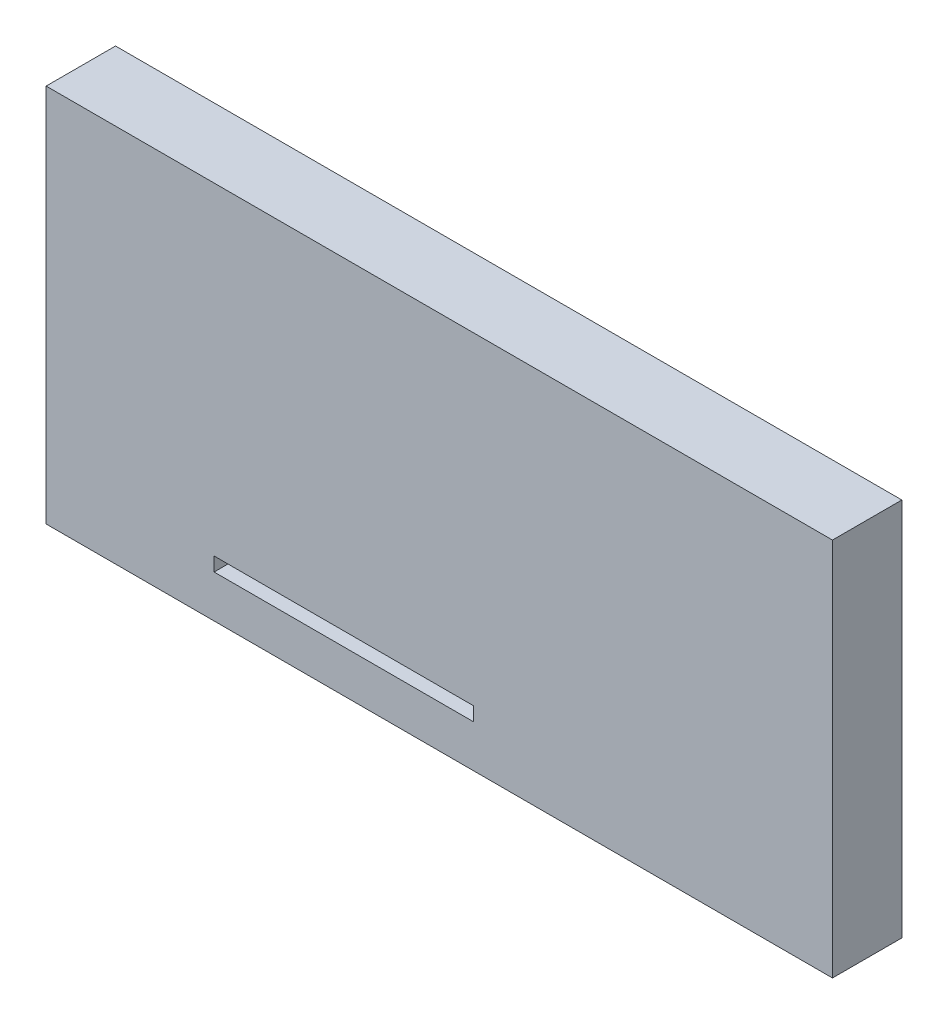
ISO-10303-21;
HEADER;
FILE_DESCRIPTION(('STEP AP214'),'2;1');
FILE_NAME('part.step','',(''),(''),'','','');
FILE_SCHEMA(('AUTOMOTIVE_DESIGN { 1 0 10303 214 1 1 1 1 }'));
ENDSEC;
DATA;
#1=APPLICATION_CONTEXT('core data for automotive mechanical design processes');
#2=APPLICATION_PROTOCOL_DEFINITION('international standard','automotive_design',2000,#1);
#3=PRODUCT_CONTEXT('',#1,'mechanical');
#4=PRODUCT('Part','Part','',(#3));
#5=PRODUCT_RELATED_PRODUCT_CATEGORY('part','',(#4));
#6=PRODUCT_DEFINITION_FORMATION('','',#4);
#7=PRODUCT_DEFINITION_CONTEXT('part definition',#1,'design');
#8=PRODUCT_DEFINITION('design','',#6,#7);
#9=PRODUCT_DEFINITION_SHAPE('','',#8);
#10=(LENGTH_UNIT() NAMED_UNIT(*) SI_UNIT(.MILLI.,.METRE.));
#11=(NAMED_UNIT(*) PLANE_ANGLE_UNIT() SI_UNIT($,.RADIAN.));
#12=(NAMED_UNIT(*) SI_UNIT($,.STERADIAN.) SOLID_ANGLE_UNIT());
#13=UNCERTAINTY_MEASURE_WITH_UNIT(LENGTH_MEASURE(1.E-05),#10,'distance_accuracy_value','');
#14=(GEOMETRIC_REPRESENTATION_CONTEXT(3) GLOBAL_UNCERTAINTY_ASSIGNED_CONTEXT((#13)) GLOBAL_UNIT_ASSIGNED_CONTEXT((#10,
#11,#12)) REPRESENTATION_CONTEXT('',''));
#15=CARTESIAN_POINT('',(0.,0.,0.));
#16=DIRECTION('',(0.,0.,1.));
#17=DIRECTION('',(1.,0.,0.));
#18=AXIS2_PLACEMENT_3D('',#15,#16,#17);
#19=CARTESIAN_POINT('',(85.,-41.,15.));
#20=DIRECTION('',(-1.,0.,0.));
#21=DIRECTION('',(0.,0.,1.));
#22=AXIS2_PLACEMENT_3D('',#19,#20,#21);
#23=PLANE('',#22);
#24=DIRECTION('',(0.,1.,0.));
#25=VECTOR('',#24,1.);
#26=CARTESIAN_POINT('',(85.,-41.,0.));
#27=LINE('',#26,#25);
#28=CARTESIAN_POINT('',(85.,-41.,0.));
#29=VERTEX_POINT('',#28);
#30=CARTESIAN_POINT('',(85.,41.,0.));
#31=VERTEX_POINT('',#30);
#32=EDGE_CURVE('E157',#29,#31,#27,.T.);
#33=ORIENTED_EDGE('',*,*,#32,.T.);
#34=DIRECTION('',(0.,0.,-1.));
#35=VECTOR('',#34,1.);
#36=CARTESIAN_POINT('',(85.,41.,15.));
#37=LINE('',#36,#35);
#38=CARTESIAN_POINT('',(85.,41.,15.));
#39=VERTEX_POINT('',#38);
#40=EDGE_CURVE('E148',#39,#31,#37,.T.);
#41=ORIENTED_EDGE('',*,*,#40,.F.);
#42=DIRECTION('',(0.,1.,0.));
#43=VECTOR('',#42,1.);
#44=CARTESIAN_POINT('',(85.,-41.,15.));
#45=LINE('',#44,#43);
#46=CARTESIAN_POINT('',(85.,-41.,15.));
#47=VERTEX_POINT('',#46);
#48=EDGE_CURVE('E158',#47,#39,#45,.T.);
#49=ORIENTED_EDGE('',*,*,#48,.F.);
#50=DIRECTION('',(0.,0.,-1.));
#51=VECTOR('',#50,1.);
#52=CARTESIAN_POINT('',(85.,-41.,15.));
#53=LINE('',#52,#51);
#54=EDGE_CURVE('E168',#47,#29,#53,.T.);
#55=ORIENTED_EDGE('',*,*,#54,.T.);
#56=EDGE_LOOP('',(#33,#41,#49,#55));
#57=FACE_BOUND('',#56,.T.);
#58=ADVANCED_FACE('F42',(#57),#23,.F.);
#59=CARTESIAN_POINT('',(-85.,41.,15.));
#60=DIRECTION('',(0.,-1.,0.));
#61=DIRECTION('',(0.,0.,-1.));
#62=AXIS2_PLACEMENT_3D('',#59,#60,#61);
#63=PLANE('',#62);
#64=DIRECTION('',(-1.,0.,0.));
#65=VECTOR('',#64,1.);
#66=CARTESIAN_POINT('',(-85.,41.,0.));
#67=LINE('',#66,#65);
#68=CARTESIAN_POINT('',(-85.,41.,0.));
#69=VERTEX_POINT('',#68);
#70=EDGE_CURVE('E171',#31,#69,#67,.T.);
#71=ORIENTED_EDGE('',*,*,#70,.T.);
#72=DIRECTION('',(0.,0.,-1.));
#73=VECTOR('',#72,1.);
#74=CARTESIAN_POINT('',(-85.,41.,15.));
#75=LINE('',#74,#73);
#76=CARTESIAN_POINT('',(-85.,41.,15.));
#77=VERTEX_POINT('',#76);
#78=EDGE_CURVE('E181',#77,#69,#75,.T.);
#79=ORIENTED_EDGE('',*,*,#78,.F.);
#80=DIRECTION('',(-1.,0.,0.));
#81=VECTOR('',#80,1.);
#82=CARTESIAN_POINT('',(-85.,41.,15.));
#83=LINE('',#82,#81);
#84=EDGE_CURVE('E161',#39,#77,#83,.T.);
#85=ORIENTED_EDGE('',*,*,#84,.F.);
#86=ORIENTED_EDGE('',*,*,#40,.T.);
#87=EDGE_LOOP('',(#71,#79,#85,#86));
#88=FACE_BOUND('',#87,.T.);
#89=ADVANCED_FACE('F186',(#88),#63,.F.);
#90=CARTESIAN_POINT('',(-85.,-41.,15.));
#91=DIRECTION('',(1.,0.,0.));
#92=DIRECTION('',(0.,0.,-1.));
#93=AXIS2_PLACEMENT_3D('',#90,#91,#92);
#94=PLANE('',#93);
#95=DIRECTION('',(0.,-1.,0.));
#96=VECTOR('',#95,1.);
#97=CARTESIAN_POINT('',(-85.,-41.,0.));
#98=LINE('',#97,#96);
#99=CARTESIAN_POINT('',(-85.,-41.,0.));
#100=VERTEX_POINT('',#99);
#101=EDGE_CURVE('E173',#69,#100,#98,.T.);
#102=ORIENTED_EDGE('',*,*,#101,.T.);
#103=DIRECTION('',(0.,0.,-1.));
#104=VECTOR('',#103,1.);
#105=CARTESIAN_POINT('',(-85.,-41.,15.));
#106=LINE('',#105,#104);
#107=CARTESIAN_POINT('',(-85.,-41.,15.));
#108=VERTEX_POINT('',#107);
#109=EDGE_CURVE('E178',#108,#100,#106,.T.);
#110=ORIENTED_EDGE('',*,*,#109,.F.);
#111=DIRECTION('',(0.,-1.,0.));
#112=VECTOR('',#111,1.);
#113=CARTESIAN_POINT('',(-85.,-41.,15.));
#114=LINE('',#113,#112);
#115=EDGE_CURVE('E164',#77,#108,#114,.T.);
#116=ORIENTED_EDGE('',*,*,#115,.F.);
#117=ORIENTED_EDGE('',*,*,#78,.T.);
#118=EDGE_LOOP('',(#102,#110,#116,#117));
#119=FACE_BOUND('',#118,.T.);
#120=ADVANCED_FACE('F198',(#119),#94,.F.);
#121=CARTESIAN_POINT('',(-85.,-41.,15.));
#122=DIRECTION('',(0.,1.,0.));
#123=DIRECTION('',(0.,0.,1.));
#124=AXIS2_PLACEMENT_3D('',#121,#122,#123);
#125=PLANE('',#124);
#126=DIRECTION('',(1.,0.,0.));
#127=VECTOR('',#126,1.);
#128=CARTESIAN_POINT('',(-85.,-41.,0.));
#129=LINE('',#128,#127);
#130=EDGE_CURVE('E162',#100,#29,#129,.T.);
#131=ORIENTED_EDGE('',*,*,#130,.T.);
#132=ORIENTED_EDGE('',*,*,#54,.F.);
#133=DIRECTION('',(1.,0.,0.));
#134=VECTOR('',#133,1.);
#135=CARTESIAN_POINT('',(-85.,-41.,15.));
#136=LINE('',#135,#134);
#137=EDGE_CURVE('E166',#108,#47,#136,.T.);
#138=ORIENTED_EDGE('',*,*,#137,.F.);
#139=ORIENTED_EDGE('',*,*,#109,.T.);
#140=EDGE_LOOP('',(#131,#132,#138,#139));
#141=FACE_BOUND('',#140,.T.);
#142=ADVANCED_FACE('F202',(#141),#125,.F.);
#143=CARTESIAN_POINT('',(0.,0.,15.));
#144=DIRECTION('',(0.,0.,-1.));
#145=DIRECTION('',(-1.,0.,0.));
#146=AXIS2_PLACEMENT_3D('',#143,#144,#145);
#147=PLANE('',#146);
#148=DIRECTION('',(1.,0.,0.));
#149=VECTOR('',#148,1.);
#150=CARTESIAN_POINT('',(7.37521942771372,-28.8306712400618,15.));
#151=LINE('',#150,#149);
#152=CARTESIAN_POINT('',(-48.6868653830344,-28.8306712400618,15.));
#153=VERTEX_POINT('',#152);
#154=CARTESIAN_POINT('',(7.37521942771372,-28.8306712400618,15.));
#155=VERTEX_POINT('',#154);
#156=EDGE_CURVE('E114',#153,#155,#151,.T.);
#157=ORIENTED_EDGE('',*,*,#156,.T.);
#158=DIRECTION('',(0.,-1.,0.));
#159=VECTOR('',#158,1.);
#160=CARTESIAN_POINT('',(7.37521942771372,-28.8306712400618,15.));
#161=LINE('',#160,#159);
#162=CARTESIAN_POINT('',(7.37521942771372,-31.8306712400618,15.));
#163=VERTEX_POINT('',#162);
#164=EDGE_CURVE('E108',#155,#163,#161,.T.);
#165=ORIENTED_EDGE('',*,*,#164,.T.);
#166=DIRECTION('',(-1.,0.,0.));
#167=VECTOR('',#166,1.);
#168=CARTESIAN_POINT('',(7.37521942771372,-31.8306712400618,15.));
#169=LINE('',#168,#167);
#170=CARTESIAN_POINT('',(-48.6868653830344,-31.8306712400618,15.));
#171=VERTEX_POINT('',#170);
#172=EDGE_CURVE('E117',#163,#171,#169,.T.);
#173=ORIENTED_EDGE('',*,*,#172,.T.);
#174=DIRECTION('',(0.,1.,0.));
#175=VECTOR('',#174,1.);
#176=CARTESIAN_POINT('',(-48.6868653830344,-28.8306712400618,15.));
#177=LINE('',#176,#175);
#178=EDGE_CURVE('E56',#171,#153,#177,.T.);
#179=ORIENTED_EDGE('',*,*,#178,.T.);
#180=EDGE_LOOP('',(#157,#165,#173,#179));
#181=FACE_BOUND('',#180,.T.);
#182=ORIENTED_EDGE('',*,*,#48,.T.);
#183=ORIENTED_EDGE('',*,*,#84,.T.);
#184=ORIENTED_EDGE('',*,*,#115,.T.);
#185=ORIENTED_EDGE('',*,*,#137,.T.);
#186=EDGE_LOOP('',(#182,#183,#184,#185));
#187=FACE_BOUND('',#186,.T.);
#188=ADVANCED_FACE('F121',(#181,#187),#147,.F.);
#189=CARTESIAN_POINT('',(0.,0.,0.));
#190=DIRECTION('',(0.,0.,-1.));
#191=DIRECTION('',(-1.,0.,0.));
#192=AXIS2_PLACEMENT_3D('',#189,#190,#191);
#193=PLANE('',#192);
#194=CARTESIAN_POINT('',(-10.,29.1638719580863,0.));
#195=DIRECTION('',(0.,0.,-1.));
#196=DIRECTION('',(-1.,0.,0.));
#197=AXIS2_PLACEMENT_3D('',#194,#195,#196);
#198=CIRCLE('',#197,2.);
#199=CARTESIAN_POINT('',(-12.,29.1638719580863,0.));
#200=VERTEX_POINT('',#199);
#201=EDGE_CURVE('E11',#200,#200,#198,.T.);
#202=ORIENTED_EDGE('',*,*,#201,.F.);
#203=EDGE_LOOP('',(#202));
#204=FACE_BOUND('',#203,.T.);
#205=DIRECTION('',(0.,-1.,0.));
#206=VECTOR('',#205,1.);
#207=CARTESIAN_POINT('',(7.37521942771372,-28.8306712400618,0.));
#208=LINE('',#207,#206);
#209=CARTESIAN_POINT('',(7.37521942771372,-28.8306712400618,0.));
#210=VERTEX_POINT('',#209);
#211=CARTESIAN_POINT('',(7.37521942771372,-31.8306712400618,0.));
#212=VERTEX_POINT('',#211);
#213=EDGE_CURVE('E64',#210,#212,#208,.T.);
#214=ORIENTED_EDGE('',*,*,#213,.F.);
#215=DIRECTION('',(1.,0.,0.));
#216=VECTOR('',#215,1.);
#217=CARTESIAN_POINT('',(7.37521942771372,-28.8306712400618,0.));
#218=LINE('',#217,#216);
#219=CARTESIAN_POINT('',(-48.6868653830344,-28.8306712400618,0.));
#220=VERTEX_POINT('',#219);
#221=EDGE_CURVE('E124',#220,#210,#218,.T.);
#222=ORIENTED_EDGE('',*,*,#221,.F.);
#223=DIRECTION('',(0.,1.,0.));
#224=VECTOR('',#223,1.);
#225=CARTESIAN_POINT('',(-48.6868653830344,-28.8306712400618,0.));
#226=LINE('',#225,#224);
#227=CARTESIAN_POINT('',(-48.6868653830344,-31.8306712400618,0.));
#228=VERTEX_POINT('',#227);
#229=EDGE_CURVE('E127',#228,#220,#226,.T.);
#230=ORIENTED_EDGE('',*,*,#229,.F.);
#231=DIRECTION('',(-1.,0.,0.));
#232=VECTOR('',#231,1.);
#233=CARTESIAN_POINT('',(7.37521942771372,-31.8306712400618,0.));
#234=LINE('',#233,#232);
#235=EDGE_CURVE('E136',#212,#228,#234,.T.);
#236=ORIENTED_EDGE('',*,*,#235,.F.);
#237=EDGE_LOOP('',(#214,#222,#230,#236));
#238=FACE_BOUND('',#237,.T.);
#239=CARTESIAN_POINT('',(0.,29.1638719580863,0.));
#240=DIRECTION('',(0.,0.,-1.));
#241=DIRECTION('',(-1.,0.,0.));
#242=AXIS2_PLACEMENT_3D('',#239,#240,#241);
#243=CIRCLE('',#242,2.);
#244=CARTESIAN_POINT('',(-2.,29.1638719580863,0.));
#245=VERTEX_POINT('',#244);
#246=EDGE_CURVE('E49',#245,#245,#243,.T.);
#247=ORIENTED_EDGE('',*,*,#246,.F.);
#248=EDGE_LOOP('',(#247));
#249=FACE_BOUND('',#248,.T.);
#250=ORIENTED_EDGE('',*,*,#32,.F.);
#251=ORIENTED_EDGE('',*,*,#130,.F.);
#252=ORIENTED_EDGE('',*,*,#101,.F.);
#253=ORIENTED_EDGE('',*,*,#70,.F.);
#254=EDGE_LOOP('',(#250,#251,#252,#253));
#255=FACE_BOUND('',#254,.T.);
#256=ADVANCED_FACE('F194',(#204,#238,#249,#255),#193,.T.);
#257=CARTESIAN_POINT('',(0.,-15.8361280419137,-13.5));
#258=DIRECTION('',(0.,-1.,0.));
#259=DIRECTION('',(-1.,0.,0.));
#260=AXIS2_PLACEMENT_3D('',#257,#258,#259);
#261=PLANE('',#260);
#262=CARTESIAN_POINT('',(0.,-15.8361280419137,-13.5));
#263=DIRECTION('',(0.,-1.,0.));
#264=DIRECTION('',(-1.,0.,0.));
#265=AXIS2_PLACEMENT_3D('',#262,#263,#264);
#266=CIRCLE('',#265,2.);
#267=CARTESIAN_POINT('',(-2.,-15.8361280419137,-13.5));
#268=VERTEX_POINT('',#267);
#269=EDGE_CURVE('E154',#268,#268,#266,.T.);
#270=ORIENTED_EDGE('',*,*,#269,.T.);
#271=EDGE_LOOP('',(#270));
#272=FACE_BOUND('',#271,.T.);
#273=ADVANCED_FACE('F209',(#272),#261,.T.);
#274=CARTESIAN_POINT('',(0.,29.1638719580863,0.));
#275=DIRECTION('',(0.,0.,-1.));
#276=DIRECTION('',(0.,1.,0.));
#277=AXIS2_PLACEMENT_3D('',#274,#275,#276);
#278=CYLINDRICAL_SURFACE('',#277,2.);
#279=CARTESIAN_POINT('',(0.,29.1638719580863,-5.5));
#280=DIRECTION('',(0.,0.,-1.));
#281=DIRECTION('',(-1.,0.,0.));
#282=AXIS2_PLACEMENT_3D('',#279,#280,#281);
#283=CIRCLE('',#282,2.);
#284=CARTESIAN_POINT('',(0.,31.1638719580864,-5.5));
#285=VERTEX_POINT('',#284);
#286=EDGE_CURVE('E142',#285,#285,#283,.T.);
#287=ORIENTED_EDGE('',*,*,#286,.F.);
#288=EDGE_LOOP('',(#287));
#289=FACE_BOUND('',#288,.T.);
#290=ORIENTED_EDGE('',*,*,#246,.T.);
#291=EDGE_LOOP('',(#290));
#292=FACE_BOUND('',#291,.T.);
#293=ADVANCED_FACE('F280',(#289,#292),#278,.T.);
#294=CARTESIAN_POINT('',(0.,21.1638719580863,-5.5));
#295=DIRECTION('',(-1.,0.,0.));
#296=DIRECTION('',(0.,0.,1.));
#297=AXIS2_PLACEMENT_3D('',#294,#295,#296);
#298=TOROIDAL_SURFACE('',#297,8.00000000000001,2.);
#299=CARTESIAN_POINT('',(0.,21.1638719580863,-13.5));
#300=DIRECTION('',(0.,-1.,0.));
#301=DIRECTION('',(-1.,0.,0.));
#302=AXIS2_PLACEMENT_3D('',#299,#300,#301);
#303=CIRCLE('',#302,2.);
#304=CARTESIAN_POINT('',(0.,21.1638719580863,-15.5));
#305=VERTEX_POINT('',#304);
#306=EDGE_CURVE('E151',#305,#305,#303,.T.);
#307=CARTESIAN_POINT('',(0.,21.1638719580863,-5.5));
#308=DIRECTION('',(-1.,0.,0.));
#309=DIRECTION('',(0.,0.,1.));
#310=AXIS2_PLACEMENT_3D('',#307,#308,#309);
#311=CIRCLE('',#310,10.);
#312=EDGE_CURVE('',#285,#305,#311,.T.);
#313=ORIENTED_EDGE('',*,*,#286,.T.);
#314=ORIENTED_EDGE('',*,*,#306,.F.);
#315=ORIENTED_EDGE('',*,*,#312,.T.);
#316=ORIENTED_EDGE('',*,*,#312,.F.);
#317=EDGE_LOOP('',(#313,#315,#314,#316));
#318=FACE_BOUND('',#317,.T.);
#319=ADVANCED_FACE('F290',(#318),#298,.T.);
#320=CARTESIAN_POINT('',(0.,21.1638719580863,-13.5));
#321=DIRECTION('',(0.,-1.,0.));
#322=DIRECTION('',(0.,0.,-1.));
#323=AXIS2_PLACEMENT_3D('',#320,#321,#322);
#324=CYLINDRICAL_SURFACE('',#323,2.);
#325=ORIENTED_EDGE('',*,*,#269,.F.);
#326=EDGE_LOOP('',(#325));
#327=FACE_BOUND('',#326,.T.);
#328=ORIENTED_EDGE('',*,*,#306,.T.);
#329=EDGE_LOOP('',(#328));
#330=FACE_BOUND('',#329,.T.);
#331=ADVANCED_FACE('F212',(#327,#330),#324,.T.);
#332=CARTESIAN_POINT('',(7.37521942771372,-28.8306712400618,15.));
#333=DIRECTION('',(1.,0.,0.));
#334=DIRECTION('',(0.,0.,-1.));
#335=AXIS2_PLACEMENT_3D('',#332,#333,#334);
#336=PLANE('',#335);
#337=ORIENTED_EDGE('',*,*,#213,.T.);
#338=DIRECTION('',(0.,0.,-1.));
#339=VECTOR('',#338,1.);
#340=CARTESIAN_POINT('',(7.37521942771372,-31.8306712400618,15.));
#341=LINE('',#340,#339);
#342=EDGE_CURVE('E104',#163,#212,#341,.T.);
#343=ORIENTED_EDGE('',*,*,#342,.F.);
#344=ORIENTED_EDGE('',*,*,#164,.F.);
#345=DIRECTION('',(0.,0.,-1.));
#346=VECTOR('',#345,1.);
#347=CARTESIAN_POINT('',(7.37521942771372,-28.8306712400618,15.));
#348=LINE('',#347,#346);
#349=EDGE_CURVE('E140',#155,#210,#348,.T.);
#350=ORIENTED_EDGE('',*,*,#349,.T.);
#351=EDGE_LOOP('',(#337,#343,#344,#350));
#352=FACE_BOUND('',#351,.T.);
#353=ADVANCED_FACE('F106',(#352),#336,.F.);
#354=CARTESIAN_POINT('',(7.37521942771372,-28.8306712400618,15.));
#355=DIRECTION('',(0.,1.,0.));
#356=DIRECTION('',(0.,0.,1.));
#357=AXIS2_PLACEMENT_3D('',#354,#355,#356);
#358=PLANE('',#357);
#359=ORIENTED_EDGE('',*,*,#221,.T.);
#360=ORIENTED_EDGE('',*,*,#349,.F.);
#361=ORIENTED_EDGE('',*,*,#156,.F.);
#362=DIRECTION('',(0.,0.,-1.));
#363=VECTOR('',#362,1.);
#364=CARTESIAN_POINT('',(-48.6868653830344,-28.8306712400618,15.));
#365=LINE('',#364,#363);
#366=EDGE_CURVE('E143',#153,#220,#365,.T.);
#367=ORIENTED_EDGE('',*,*,#366,.T.);
#368=EDGE_LOOP('',(#359,#360,#361,#367));
#369=FACE_BOUND('',#368,.T.);
#370=ADVANCED_FACE('F320',(#369),#358,.F.);
#371=CARTESIAN_POINT('',(-48.6868653830344,-28.8306712400618,15.));
#372=DIRECTION('',(-1.,0.,0.));
#373=DIRECTION('',(0.,0.,1.));
#374=AXIS2_PLACEMENT_3D('',#371,#372,#373);
#375=PLANE('',#374);
#376=ORIENTED_EDGE('',*,*,#229,.T.);
#377=ORIENTED_EDGE('',*,*,#366,.F.);
#378=ORIENTED_EDGE('',*,*,#178,.F.);
#379=DIRECTION('',(0.,0.,-1.));
#380=VECTOR('',#379,1.);
#381=CARTESIAN_POINT('',(-48.6868653830344,-31.8306712400618,15.));
#382=LINE('',#381,#380);
#383=EDGE_CURVE('E113',#171,#228,#382,.T.);
#384=ORIENTED_EDGE('',*,*,#383,.T.);
#385=EDGE_LOOP('',(#376,#377,#378,#384));
#386=FACE_BOUND('',#385,.T.);
#387=ADVANCED_FACE('F330',(#386),#375,.F.);
#388=CARTESIAN_POINT('',(7.37521942771372,-31.8306712400618,15.));
#389=DIRECTION('',(0.,-1.,0.));
#390=DIRECTION('',(0.,0.,-1.));
#391=AXIS2_PLACEMENT_3D('',#388,#389,#390);
#392=PLANE('',#391);
#393=ORIENTED_EDGE('',*,*,#235,.T.);
#394=ORIENTED_EDGE('',*,*,#383,.F.);
#395=ORIENTED_EDGE('',*,*,#172,.F.);
#396=ORIENTED_EDGE('',*,*,#342,.T.);
#397=EDGE_LOOP('',(#393,#394,#395,#396));
#398=FACE_BOUND('',#397,.T.);
#399=ADVANCED_FACE('F118',(#398),#392,.F.);
#400=CARTESIAN_POINT('',(-10.,-15.8361280419137,-13.5));
#401=DIRECTION('',(0.,-1.,0.));
#402=DIRECTION('',(-1.,0.,0.));
#403=AXIS2_PLACEMENT_3D('',#400,#401,#402);
#404=PLANE('',#403);
#405=CARTESIAN_POINT('',(-10.,-15.8361280419137,-13.5));
#406=DIRECTION('',(0.,-1.,0.));
#407=DIRECTION('',(-1.,0.,0.));
#408=AXIS2_PLACEMENT_3D('',#405,#406,#407);
#409=CIRCLE('',#408,2.);
#410=CARTESIAN_POINT('',(-12.,-15.8361280419137,-13.5));
#411=VERTEX_POINT('',#410);
#412=EDGE_CURVE('E130',#411,#411,#409,.T.);
#413=ORIENTED_EDGE('',*,*,#412,.T.);
#414=EDGE_LOOP('',(#413));
#415=FACE_BOUND('',#414,.T.);
#416=ADVANCED_FACE('F349',(#415),#404,.T.);
#417=CARTESIAN_POINT('',(-10.,29.1638719580863,0.));
#418=DIRECTION('',(0.,0.,-1.));
#419=DIRECTION('',(0.,1.,0.));
#420=AXIS2_PLACEMENT_3D('',#417,#418,#419);
#421=CYLINDRICAL_SURFACE('',#420,2.);
#422=CARTESIAN_POINT('',(-10.,29.1638719580863,-5.5));
#423=DIRECTION('',(0.,0.,-1.));
#424=DIRECTION('',(-1.,0.,0.));
#425=AXIS2_PLACEMENT_3D('',#422,#423,#424);
#426=CIRCLE('',#425,2.);
#427=CARTESIAN_POINT('',(-10.,31.1638719580864,-5.5));
#428=VERTEX_POINT('',#427);
#429=EDGE_CURVE('E420',#428,#428,#426,.T.);
#430=ORIENTED_EDGE('',*,*,#429,.F.);
#431=EDGE_LOOP('',(#430));
#432=FACE_BOUND('',#431,.T.);
#433=ORIENTED_EDGE('',*,*,#201,.T.);
#434=EDGE_LOOP('',(#433));
#435=FACE_BOUND('',#434,.T.);
#436=ADVANCED_FACE('F359',(#432,#435),#421,.T.);
#437=CARTESIAN_POINT('',(-10.,21.1638719580863,-5.5));
#438=DIRECTION('',(-1.,0.,0.));
#439=DIRECTION('',(0.,0.,1.));
#440=AXIS2_PLACEMENT_3D('',#437,#438,#439);
#441=TOROIDAL_SURFACE('',#440,8.00000000000001,2.);
#442=CARTESIAN_POINT('',(-10.,21.1638719580863,-13.5));
#443=DIRECTION('',(0.,-1.,0.));
#444=DIRECTION('',(-1.,0.,0.));
#445=AXIS2_PLACEMENT_3D('',#442,#443,#444);
#446=CIRCLE('',#445,2.);
#447=CARTESIAN_POINT('',(-10.,21.1638719580863,-15.5));
#448=VERTEX_POINT('',#447);
#449=EDGE_CURVE('E419',#448,#448,#446,.T.);
#450=CARTESIAN_POINT('',(-10.,21.1638719580863,-5.5));
#451=DIRECTION('',(-1.,0.,0.));
#452=DIRECTION('',(0.,0.,1.));
#453=AXIS2_PLACEMENT_3D('',#450,#451,#452);
#454=CIRCLE('',#453,10.);
#455=EDGE_CURVE('',#428,#448,#454,.T.);
#456=ORIENTED_EDGE('',*,*,#429,.T.);
#457=ORIENTED_EDGE('',*,*,#449,.F.);
#458=ORIENTED_EDGE('',*,*,#455,.T.);
#459=ORIENTED_EDGE('',*,*,#455,.F.);
#460=EDGE_LOOP('',(#456,#458,#457,#459));
#461=FACE_BOUND('',#460,.T.);
#462=ADVANCED_FACE('F370',(#461),#441,.T.);
#463=CARTESIAN_POINT('',(-10.,21.1638719580863,-13.5));
#464=DIRECTION('',(0.,-1.,0.));
#465=DIRECTION('',(0.,0.,-1.));
#466=AXIS2_PLACEMENT_3D('',#463,#464,#465);
#467=CYLINDRICAL_SURFACE('',#466,2.);
#468=ORIENTED_EDGE('',*,*,#412,.F.);
#469=EDGE_LOOP('',(#468));
#470=FACE_BOUND('',#469,.T.);
#471=ORIENTED_EDGE('',*,*,#449,.T.);
#472=EDGE_LOOP('',(#471));
#473=FACE_BOUND('',#472,.T.);
#474=ADVANCED_FACE('F351',(#470,#473),#467,.T.);
#475=CLOSED_SHELL('',(#58,#89,#120,#142,#188,#256,#273,#293,#319,#331,#353,#370,#387,#399,#416,
#436,#462,#474));
#476=MANIFOLD_SOLID_BREP('B2',#475);
#477=ADVANCED_BREP_SHAPE_REPRESENTATION('',(#18,#476),#14);
#478=SHAPE_DEFINITION_REPRESENTATION(#9,#477);
ENDSEC;
END-ISO-10303-21;
